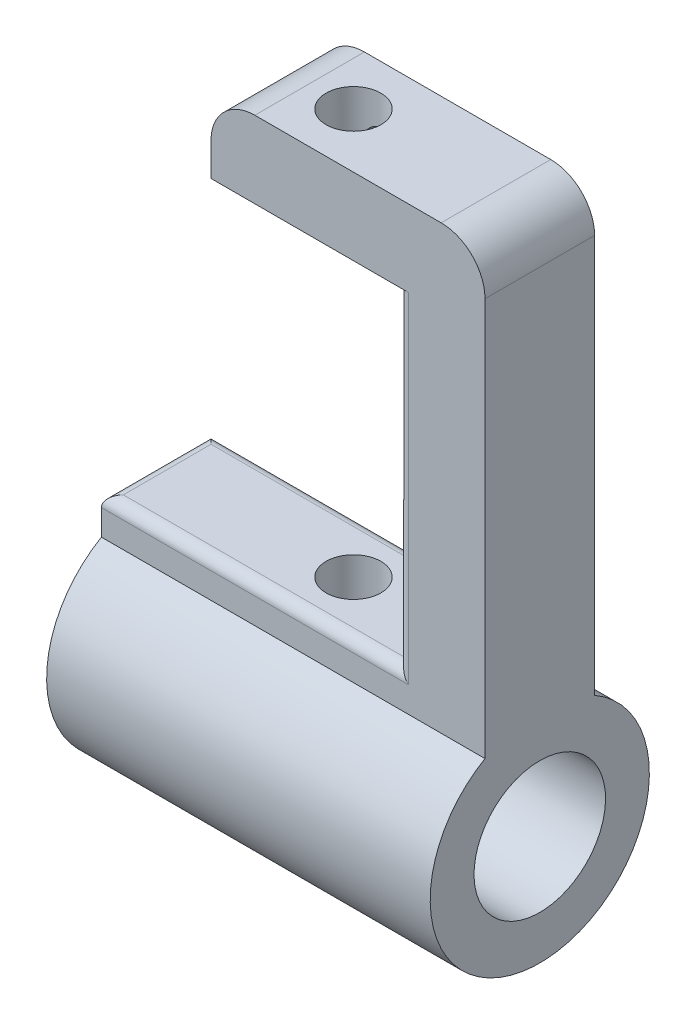
ISO-10303-21;
HEADER;
FILE_DESCRIPTION(('STEP AP214'),'2;1');
FILE_NAME('part.step','',(''),(''),'','','');
FILE_SCHEMA(('AUTOMOTIVE_DESIGN { 1 0 10303 214 1 1 1 1 }'));
ENDSEC;
DATA;
#1=APPLICATION_CONTEXT('core data for automotive mechanical design processes');
#2=APPLICATION_PROTOCOL_DEFINITION('international standard','automotive_design',2000,#1);
#3=PRODUCT_CONTEXT('',#1,'mechanical');
#4=PRODUCT('Part','Part','',(#3));
#5=PRODUCT_RELATED_PRODUCT_CATEGORY('part','',(#4));
#6=PRODUCT_DEFINITION_FORMATION('','',#4);
#7=PRODUCT_DEFINITION_CONTEXT('part definition',#1,'design');
#8=PRODUCT_DEFINITION('design','',#6,#7);
#9=PRODUCT_DEFINITION_SHAPE('','',#8);
#10=(LENGTH_UNIT() NAMED_UNIT(*) SI_UNIT(.MILLI.,.METRE.));
#11=(NAMED_UNIT(*) PLANE_ANGLE_UNIT() SI_UNIT($,.RADIAN.));
#12=(NAMED_UNIT(*) SI_UNIT($,.STERADIAN.) SOLID_ANGLE_UNIT());
#13=UNCERTAINTY_MEASURE_WITH_UNIT(LENGTH_MEASURE(1.E-05),#10,'distance_accuracy_value','');
#14=(GEOMETRIC_REPRESENTATION_CONTEXT(3) GLOBAL_UNCERTAINTY_ASSIGNED_CONTEXT((#13)) GLOBAL_UNIT_ASSIGNED_CONTEXT((#10,
#11,#12)) REPRESENTATION_CONTEXT('',''));
#15=CARTESIAN_POINT('',(0.,0.,0.));
#16=DIRECTION('',(0.,0.,1.));
#17=DIRECTION('',(1.,0.,0.));
#18=AXIS2_PLACEMENT_3D('',#15,#16,#17);
#19=CARTESIAN_POINT('',(-4.,41.,-10.));
#20=DIRECTION('',(0.,0.,1.));
#21=DIRECTION('',(-1.,0.,0.));
#22=AXIS2_PLACEMENT_3D('',#19,#20,#21);
#23=CYLINDRICAL_SURFACE('',#22,4.);
#24=CARTESIAN_POINT('',(-4.,41.,0.));
#25=DIRECTION('',(0.,0.,1.));
#26=DIRECTION('',(-1.,0.,0.));
#27=AXIS2_PLACEMENT_3D('',#24,#25,#26);
#28=CIRCLE('',#27,4.);
#29=CARTESIAN_POINT('',(0.,41.,0.));
#30=VERTEX_POINT('',#29);
#31=CARTESIAN_POINT('',(-4.,45.,0.));
#32=VERTEX_POINT('',#31);
#33=EDGE_CURVE('E335',#30,#32,#28,.T.);
#34=ORIENTED_EDGE('',*,*,#33,.F.);
#35=DIRECTION('',(0.,0.,1.));
#36=VECTOR('',#35,1.);
#37=CARTESIAN_POINT('',(0.,41.,-10.));
#38=LINE('',#37,#36);
#39=CARTESIAN_POINT('',(0.,41.,-10.));
#40=VERTEX_POINT('',#39);
#41=EDGE_CURVE('E296',#40,#30,#38,.T.);
#42=ORIENTED_EDGE('',*,*,#41,.F.);
#43=CARTESIAN_POINT('',(-4.,41.,-10.));
#44=DIRECTION('',(0.,0.,1.));
#45=DIRECTION('',(-1.,0.,0.));
#46=AXIS2_PLACEMENT_3D('',#43,#44,#45);
#47=CIRCLE('',#46,4.);
#48=CARTESIAN_POINT('',(-4.,45.,-10.));
#49=VERTEX_POINT('',#48);
#50=EDGE_CURVE('E354',#40,#49,#47,.T.);
#51=ORIENTED_EDGE('',*,*,#50,.T.);
#52=DIRECTION('',(0.,0.,1.));
#53=VECTOR('',#52,1.);
#54=CARTESIAN_POINT('',(-4.,45.,-10.));
#55=LINE('',#54,#53);
#56=EDGE_CURVE('E313',#49,#32,#55,.T.);
#57=ORIENTED_EDGE('',*,*,#56,.T.);
#58=EDGE_LOOP('',(#34,#42,#51,#57));
#59=FACE_BOUND('',#58,.T.);
#60=ADVANCED_FACE('F45',(#59),#23,.T.);
#61=CARTESIAN_POINT('',(-21.,45.,-10.));
#62=DIRECTION('',(0.,-1.,0.));
#63=DIRECTION('',(0.,0.,1.));
#64=AXIS2_PLACEMENT_3D('',#61,#62,#63);
#65=PLANE('',#64);
#66=CARTESIAN_POINT('',(-17.,45.,-5.00000000000001));
#67=DIRECTION('',(0.,-1.,0.));
#68=DIRECTION('',(0.,0.,-1.));
#69=AXIS2_PLACEMENT_3D('',#66,#67,#68);
#70=CIRCLE('',#69,2.5);
#71=CARTESIAN_POINT('',(-17.,45.,-7.50000000000001));
#72=VERTEX_POINT('',#71);
#73=EDGE_CURVE('E254',#72,#72,#70,.T.);
#74=ORIENTED_EDGE('',*,*,#73,.T.);
#75=EDGE_LOOP('',(#74));
#76=FACE_BOUND('',#75,.T.);
#77=DIRECTION('',(-1.,0.,0.));
#78=VECTOR('',#77,1.);
#79=CARTESIAN_POINT('',(-21.,45.,0.));
#80=LINE('',#79,#78);
#81=CARTESIAN_POINT('',(-21.,45.,0.));
#82=VERTEX_POINT('',#81);
#83=EDGE_CURVE('E338',#32,#82,#80,.T.);
#84=ORIENTED_EDGE('',*,*,#83,.F.);
#85=ORIENTED_EDGE('',*,*,#56,.F.);
#86=DIRECTION('',(-1.,0.,0.));
#87=VECTOR('',#86,1.);
#88=CARTESIAN_POINT('',(-21.,45.,-10.));
#89=LINE('',#88,#87);
#90=CARTESIAN_POINT('',(-21.,45.,-10.));
#91=VERTEX_POINT('',#90);
#92=EDGE_CURVE('E357',#49,#91,#89,.T.);
#93=ORIENTED_EDGE('',*,*,#92,.T.);
#94=DIRECTION('',(0.,0.,1.));
#95=VECTOR('',#94,1.);
#96=CARTESIAN_POINT('',(-21.,45.,-10.));
#97=LINE('',#96,#95);
#98=EDGE_CURVE('E310',#91,#82,#97,.T.);
#99=ORIENTED_EDGE('',*,*,#98,.T.);
#100=EDGE_LOOP('',(#84,#85,#93,#99));
#101=FACE_BOUND('',#100,.T.);
#102=ADVANCED_FACE('F224',(#76,#101),#65,.F.);
#103=CARTESIAN_POINT('',(-21.,41.,-10.));
#104=DIRECTION('',(0.,0.,1.));
#105=DIRECTION('',(-1.,0.,0.));
#106=AXIS2_PLACEMENT_3D('',#103,#104,#105);
#107=CYLINDRICAL_SURFACE('',#106,4.);
#108=CARTESIAN_POINT('',(-21.,41.,0.));
#109=DIRECTION('',(0.,0.,1.));
#110=DIRECTION('',(1.,0.,0.));
#111=AXIS2_PLACEMENT_3D('',#108,#109,#110);
#112=CIRCLE('',#111,4.);
#113=CARTESIAN_POINT('',(-25.,41.,0.));
#114=VERTEX_POINT('',#113);
#115=EDGE_CURVE('E342',#82,#114,#112,.T.);
#116=ORIENTED_EDGE('',*,*,#115,.F.);
#117=ORIENTED_EDGE('',*,*,#98,.F.);
#118=CARTESIAN_POINT('',(-21.,41.,-10.));
#119=DIRECTION('',(0.,0.,1.));
#120=DIRECTION('',(1.,0.,0.));
#121=AXIS2_PLACEMENT_3D('',#118,#119,#120);
#122=CIRCLE('',#121,4.);
#123=CARTESIAN_POINT('',(-25.,41.,-10.));
#124=VERTEX_POINT('',#123);
#125=EDGE_CURVE('E330',#91,#124,#122,.T.);
#126=ORIENTED_EDGE('',*,*,#125,.T.);
#127=DIRECTION('',(0.,0.,1.));
#128=VECTOR('',#127,1.);
#129=CARTESIAN_POINT('',(-25.,41.,-10.));
#130=LINE('',#129,#128);
#131=EDGE_CURVE('E307',#124,#114,#130,.T.);
#132=ORIENTED_EDGE('',*,*,#131,.T.);
#133=EDGE_LOOP('',(#116,#117,#126,#132));
#134=FACE_BOUND('',#133,.T.);
#135=ADVANCED_FACE('F220',(#134),#107,.T.);
#136=CARTESIAN_POINT('',(-25.,38.,-10.));
#137=DIRECTION('',(1.,0.,0.));
#138=DIRECTION('',(0.,0.,1.));
#139=AXIS2_PLACEMENT_3D('',#136,#137,#138);
#140=PLANE('',#139);
#141=DIRECTION('',(0.,-1.,0.));
#142=VECTOR('',#141,1.);
#143=CARTESIAN_POINT('',(-25.,38.,0.));
#144=LINE('',#143,#142);
#145=CARTESIAN_POINT('',(-25.,38.,0.));
#146=VERTEX_POINT('',#145);
#147=EDGE_CURVE('E345',#114,#146,#144,.T.);
#148=ORIENTED_EDGE('',*,*,#147,.F.);
#149=ORIENTED_EDGE('',*,*,#131,.F.);
#150=DIRECTION('',(0.,-1.,0.));
#151=VECTOR('',#150,1.);
#152=CARTESIAN_POINT('',(-25.,38.,-10.));
#153=LINE('',#152,#151);
#154=CARTESIAN_POINT('',(-25.,38.,-10.));
#155=VERTEX_POINT('',#154);
#156=EDGE_CURVE('E327',#124,#155,#153,.T.);
#157=ORIENTED_EDGE('',*,*,#156,.T.);
#158=DIRECTION('',(0.,0.,1.));
#159=VECTOR('',#158,1.);
#160=CARTESIAN_POINT('',(-25.,38.,-10.));
#161=LINE('',#160,#159);
#162=EDGE_CURVE('E298',#155,#146,#161,.T.);
#163=ORIENTED_EDGE('',*,*,#162,.T.);
#164=EDGE_LOOP('',(#148,#149,#157,#163));
#165=FACE_BOUND('',#164,.T.);
#166=ADVANCED_FACE('F216',(#165),#140,.F.);
#167=CARTESIAN_POINT('',(-8.,38.,-10.));
#168=DIRECTION('',(0.,1.,0.));
#169=DIRECTION('',(-1.,0.,0.));
#170=AXIS2_PLACEMENT_3D('',#167,#168,#169);
#171=PLANE('',#170);
#172=CARTESIAN_POINT('',(-17.,38.,-5.00000000000001));
#173=DIRECTION('',(0.,-1.,0.));
#174=DIRECTION('',(-1.,0.,0.));
#175=AXIS2_PLACEMENT_3D('',#172,#173,#174);
#176=CIRCLE('',#175,2.5);
#177=CARTESIAN_POINT('',(-19.5,38.,-5.00000000000001));
#178=VERTEX_POINT('',#177);
#179=EDGE_CURVE('E321',#178,#178,#176,.T.);
#180=ORIENTED_EDGE('',*,*,#179,.F.);
#181=EDGE_LOOP('',(#180));
#182=FACE_BOUND('',#181,.T.);
#183=DIRECTION('',(1.,0.,0.));
#184=VECTOR('',#183,1.);
#185=CARTESIAN_POINT('',(-8.,38.,0.));
#186=LINE('',#185,#184);
#187=CARTESIAN_POINT('',(-7.,38.,0.));
#188=VERTEX_POINT('',#187);
#189=EDGE_CURVE('E348',#146,#188,#186,.T.);
#190=ORIENTED_EDGE('',*,*,#189,.F.);
#191=ORIENTED_EDGE('',*,*,#162,.F.);
#192=DIRECTION('',(1.,0.,0.));
#193=VECTOR('',#192,1.);
#194=CARTESIAN_POINT('',(-8.,38.,-10.));
#195=LINE('',#194,#193);
#196=CARTESIAN_POINT('',(-7.,38.,-10.));
#197=VERTEX_POINT('',#196);
#198=EDGE_CURVE('E325',#155,#197,#195,.T.);
#199=ORIENTED_EDGE('',*,*,#198,.T.);
#200=CARTESIAN_POINT('',(-7.,38.,-9.));
#201=DIRECTION('',(0.,-1.,0.));
#202=DIRECTION('',(-1.,0.,0.));
#203=AXIS2_PLACEMENT_3D('',#200,#201,#202);
#204=CIRCLE('',#203,1.);
#205=CARTESIAN_POINT('',(-8.,38.,-9.));
#206=VERTEX_POINT('',#205);
#207=EDGE_CURVE('E11',#206,#197,#204,.T.);
#208=ORIENTED_EDGE('',*,*,#207,.F.);
#209=DIRECTION('',(0.,0.,1.));
#210=VECTOR('',#209,1.);
#211=CARTESIAN_POINT('',(-8.,38.,-10.));
#212=LINE('',#211,#210);
#213=CARTESIAN_POINT('',(-8.,38.,-0.999999999999999));
#214=VERTEX_POINT('',#213);
#215=EDGE_CURVE('E295',#206,#214,#212,.T.);
#216=ORIENTED_EDGE('',*,*,#215,.T.);
#217=CARTESIAN_POINT('',(-7.,38.,-0.999999999999999));
#218=DIRECTION('',(0.,-1.,0.));
#219=DIRECTION('',(-1.,0.,0.));
#220=AXIS2_PLACEMENT_3D('',#217,#218,#219);
#221=CIRCLE('',#220,1.);
#222=EDGE_CURVE('E59',#188,#214,#221,.T.);
#223=ORIENTED_EDGE('',*,*,#222,.F.);
#224=EDGE_LOOP('',(#190,#191,#199,#208,#216,#223));
#225=FACE_BOUND('',#224,.T.);
#226=ADVANCED_FACE('F212',(#182,#225),#171,.F.);
#227=CARTESIAN_POINT('',(-8.,7.99999999999998,-10.));
#228=DIRECTION('',(1.,0.,0.));
#229=DIRECTION('',(0.,1.,0.));
#230=AXIS2_PLACEMENT_3D('',#227,#228,#229);
#231=PLANE('',#230);
#232=ORIENTED_EDGE('',*,*,#215,.F.);
#233=DIRECTION('',(0.,-1.,0.));
#234=VECTOR('',#233,1.);
#235=CARTESIAN_POINT('',(-8.,7.99999999999998,-9.));
#236=LINE('',#235,#234);
#237=CARTESIAN_POINT('',(-8.,7.99999999999998,-9.));
#238=VERTEX_POINT('',#237);
#239=EDGE_CURVE('E293',#238,#206,#236,.F.);
#240=ORIENTED_EDGE('',*,*,#239,.F.);
#241=DIRECTION('',(0.,0.,1.));
#242=VECTOR('',#241,1.);
#243=CARTESIAN_POINT('',(-8.,7.99999999999998,-10.));
#244=LINE('',#243,#242);
#245=CARTESIAN_POINT('',(-8.,7.99999999999998,-0.999999999999999));
#246=VERTEX_POINT('',#245);
#247=EDGE_CURVE('E287',#238,#246,#244,.T.);
#248=ORIENTED_EDGE('',*,*,#247,.T.);
#249=DIRECTION('',(0.,-1.,0.));
#250=VECTOR('',#249,1.);
#251=CARTESIAN_POINT('',(-8.,7.99999999999998,-0.999999999999999));
#252=LINE('',#251,#250);
#253=EDGE_CURVE('E289',#214,#246,#252,.T.);
#254=ORIENTED_EDGE('',*,*,#253,.F.);
#255=EDGE_LOOP('',(#232,#240,#248,#254));
#256=FACE_BOUND('',#255,.T.);
#257=ADVANCED_FACE('F208',(#256),#231,.F.);
#258=CARTESIAN_POINT('',(-35.,7.99999999999998,-10.));
#259=DIRECTION('',(0.,-1.,0.));
#260=DIRECTION('',(0.,0.,1.));
#261=AXIS2_PLACEMENT_3D('',#258,#259,#260);
#262=PLANE('',#261);
#263=ORIENTED_EDGE('',*,*,#247,.F.);
#264=DIRECTION('',(-1.,0.,0.));
#265=VECTOR('',#264,1.);
#266=CARTESIAN_POINT('',(-35.,7.99999999999998,-9.));
#267=LINE('',#266,#265);
#268=CARTESIAN_POINT('',(-34.,7.99999999999998,-9.));
#269=VERTEX_POINT('',#268);
#270=EDGE_CURVE('E252',#269,#238,#267,.F.);
#271=ORIENTED_EDGE('',*,*,#270,.F.);
#272=DIRECTION('',(0.,0.,1.));
#273=VECTOR('',#272,1.);
#274=CARTESIAN_POINT('',(-34.,7.99999999999998,-10.));
#275=LINE('',#274,#273);
#276=CARTESIAN_POINT('',(-34.,7.99999999999998,-0.999999999999999));
#277=VERTEX_POINT('',#276);
#278=EDGE_CURVE('E259',#277,#269,#275,.F.);
#279=ORIENTED_EDGE('',*,*,#278,.F.);
#280=DIRECTION('',(-1.,0.,0.));
#281=VECTOR('',#280,1.);
#282=CARTESIAN_POINT('',(-35.,7.99999999999998,-0.999999999999999));
#283=LINE('',#282,#281);
#284=EDGE_CURVE('E272',#246,#277,#283,.T.);
#285=ORIENTED_EDGE('',*,*,#284,.F.);
#286=EDGE_LOOP('',(#263,#271,#279,#285));
#287=FACE_BOUND('',#286,.T.);
#288=CARTESIAN_POINT('',(-17.,7.99999999999998,-5.00000000000001));
#289=DIRECTION('',(0.,1.,0.));
#290=DIRECTION('',(0.,0.,1.));
#291=AXIS2_PLACEMENT_3D('',#288,#289,#290);
#292=CIRCLE('',#291,2.5);
#293=CARTESIAN_POINT('',(-17.,7.99999999999998,-2.50000000000001));
#294=VERTEX_POINT('',#293);
#295=EDGE_CURVE('E318',#294,#294,#292,.T.);
#296=ORIENTED_EDGE('',*,*,#295,.F.);
#297=EDGE_LOOP('',(#296));
#298=FACE_BOUND('',#297,.T.);
#299=ADVANCED_FACE('F204',(#287,#298),#262,.F.);
#300=CARTESIAN_POINT('',(-35.,0.,-10.));
#301=DIRECTION('',(1.,0.,0.));
#302=DIRECTION('',(0.,0.,1.));
#303=AXIS2_PLACEMENT_3D('',#300,#301,#302);
#304=PLANE('',#303);
#305=CARTESIAN_POINT('',(-35.,-4.00000000000001,-5.));
#306=DIRECTION('',(-1.,0.,0.));
#307=DIRECTION('',(0.,1.,0.));
#308=AXIS2_PLACEMENT_3D('',#305,#306,#307);
#309=CIRCLE('',#308,6.);
#310=CARTESIAN_POINT('',(-35.,1.99999999999999,-5.));
#311=VERTEX_POINT('',#310);
#312=EDGE_CURVE('E382',#311,#311,#309,.T.);
#313=ORIENTED_EDGE('',*,*,#312,.F.);
#314=EDGE_LOOP('',(#313));
#315=FACE_BOUND('',#314,.T.);
#316=DIRECTION('',(0.,-1.,0.));
#317=VECTOR('',#316,1.);
#318=CARTESIAN_POINT('',(-35.,0.,-10.));
#319=LINE('',#318,#317);
#320=CARTESIAN_POINT('',(-35.,6.99999999999998,-10.));
#321=VERTEX_POINT('',#320);
#322=CARTESIAN_POINT('',(-35.,4.66025403784439,-10.));
#323=VERTEX_POINT('',#322);
#324=EDGE_CURVE('E263',#321,#323,#319,.T.);
#325=ORIENTED_EDGE('',*,*,#324,.T.);
#326=CARTESIAN_POINT('',(-35.,-4.,-5.));
#327=DIRECTION('',(-1.,0.,0.));
#328=DIRECTION('',(0.,1.,0.));
#329=AXIS2_PLACEMENT_3D('',#326,#327,#328);
#330=CIRCLE('',#329,10.);
#331=CARTESIAN_POINT('',(-35.,4.66025403784439,0.));
#332=VERTEX_POINT('',#331);
#333=EDGE_CURVE('E377',#323,#332,#330,.T.);
#334=ORIENTED_EDGE('',*,*,#333,.T.);
#335=DIRECTION('',(0.,-1.,0.));
#336=VECTOR('',#335,1.);
#337=CARTESIAN_POINT('',(-35.,0.,0.));
#338=LINE('',#337,#336);
#339=CARTESIAN_POINT('',(-35.,6.99999999999998,0.));
#340=VERTEX_POINT('',#339);
#341=EDGE_CURVE('E351',#340,#332,#338,.T.);
#342=ORIENTED_EDGE('',*,*,#341,.F.);
#343=DIRECTION('',(0.,0.,1.));
#344=VECTOR('',#343,1.);
#345=CARTESIAN_POINT('',(-35.,6.99999999999998,-10.));
#346=LINE('',#345,#344);
#347=EDGE_CURVE('E274',#321,#340,#346,.T.);
#348=ORIENTED_EDGE('',*,*,#347,.F.);
#349=EDGE_LOOP('',(#325,#334,#342,#348));
#350=FACE_BOUND('',#349,.T.);
#351=ADVANCED_FACE('F200',(#315,#350),#304,.F.);
#352=CARTESIAN_POINT('',(0.,41.,-10.));
#353=DIRECTION('',(-1.,0.,0.));
#354=DIRECTION('',(0.,-1.,0.));
#355=AXIS2_PLACEMENT_3D('',#352,#353,#354);
#356=PLANE('',#355);
#357=CARTESIAN_POINT('',(0.,-4.,-5.));
#358=DIRECTION('',(-1.,0.,0.));
#359=DIRECTION('',(0.,1.,0.));
#360=AXIS2_PLACEMENT_3D('',#357,#358,#359);
#361=CIRCLE('',#360,6.);
#362=CARTESIAN_POINT('',(0.,2.,-5.));
#363=VERTEX_POINT('',#362);
#364=EDGE_CURVE('E384',#363,#363,#361,.T.);
#365=ORIENTED_EDGE('',*,*,#364,.T.);
#366=EDGE_LOOP('',(#365));
#367=FACE_BOUND('',#366,.T.);
#368=DIRECTION('',(0.,1.,0.));
#369=VECTOR('',#368,1.);
#370=CARTESIAN_POINT('',(0.,41.,-10.));
#371=LINE('',#370,#369);
#372=CARTESIAN_POINT('',(0.,4.6602540378444,-10.));
#373=VERTEX_POINT('',#372);
#374=EDGE_CURVE('E301',#373,#40,#371,.T.);
#375=ORIENTED_EDGE('',*,*,#374,.T.);
#376=ORIENTED_EDGE('',*,*,#41,.T.);
#377=DIRECTION('',(0.,1.,0.));
#378=VECTOR('',#377,1.);
#379=CARTESIAN_POINT('',(0.,41.,0.));
#380=LINE('',#379,#378);
#381=CARTESIAN_POINT('',(0.,4.66025403784441,0.));
#382=VERTEX_POINT('',#381);
#383=EDGE_CURVE('E353',#382,#30,#380,.T.);
#384=ORIENTED_EDGE('',*,*,#383,.F.);
#385=CARTESIAN_POINT('',(0.,-4.,-5.));
#386=DIRECTION('',(-1.,0.,0.));
#387=DIRECTION('',(0.,1.,0.));
#388=AXIS2_PLACEMENT_3D('',#385,#386,#387);
#389=CIRCLE('',#388,10.);
#390=EDGE_CURVE('E375',#373,#382,#389,.T.);
#391=ORIENTED_EDGE('',*,*,#390,.F.);
#392=EDGE_LOOP('',(#375,#376,#384,#391));
#393=FACE_BOUND('',#392,.T.);
#394=ADVANCED_FACE('F193',(#367,#393),#356,.F.);
#395=CARTESIAN_POINT('',(-4.,41.,-10.));
#396=DIRECTION('',(0.,0.,1.));
#397=DIRECTION('',(-1.,0.,0.));
#398=AXIS2_PLACEMENT_3D('',#395,#396,#397);
#399=PLANE('',#398);
#400=CARTESIAN_POINT('',(-17.,41.,-10.));
#401=DIRECTION('',(0.,0.,1.));
#402=DIRECTION('',(1.,0.,0.));
#403=AXIS2_PLACEMENT_3D('',#400,#401,#402);
#404=CIRCLE('',#403,1.525);
#405=CARTESIAN_POINT('',(-15.475,41.,-10.));
#406=VERTEX_POINT('',#405);
#407=EDGE_CURVE('E163',#406,#406,#404,.T.);
#408=ORIENTED_EDGE('',*,*,#407,.T.);
#409=EDGE_LOOP('',(#408));
#410=FACE_BOUND('',#409,.T.);
#411=ORIENTED_EDGE('',*,*,#198,.F.);
#412=ORIENTED_EDGE('',*,*,#156,.F.);
#413=ORIENTED_EDGE('',*,*,#125,.F.);
#414=ORIENTED_EDGE('',*,*,#92,.F.);
#415=ORIENTED_EDGE('',*,*,#50,.F.);
#416=ORIENTED_EDGE('',*,*,#374,.F.);
#417=DIRECTION('',(1.,0.,0.));
#418=VECTOR('',#417,1.);
#419=CARTESIAN_POINT('',(-35.,4.66025403784439,-10.));
#420=LINE('',#419,#418);
#421=EDGE_CURVE('E339',#323,#373,#420,.T.);
#422=ORIENTED_EDGE('',*,*,#421,.F.);
#423=ORIENTED_EDGE('',*,*,#324,.F.);
#424=DIRECTION('',(-1.,0.,0.));
#425=VECTOR('',#424,1.);
#426=CARTESIAN_POINT('',(-4.,6.99999999999999,-10.));
#427=LINE('',#426,#425);
#428=CARTESIAN_POINT('',(-7.,6.99999999999999,-10.));
#429=VERTEX_POINT('',#428);
#430=EDGE_CURVE('E249',#429,#321,#427,.T.);
#431=ORIENTED_EDGE('',*,*,#430,.F.);
#432=DIRECTION('',(0.,-1.,0.));
#433=VECTOR('',#432,1.);
#434=CARTESIAN_POINT('',(-7.,41.,-10.));
#435=LINE('',#434,#433);
#436=EDGE_CURVE('E255',#197,#429,#435,.T.);
#437=ORIENTED_EDGE('',*,*,#436,.F.);
#438=EDGE_LOOP('',(#411,#412,#413,#414,#415,#416,#422,#423,#431,#437));
#439=FACE_BOUND('',#438,.T.);
#440=ADVANCED_FACE('F190',(#410,#439),#399,.F.);
#441=CARTESIAN_POINT('',(-4.,41.,0.));
#442=DIRECTION('',(0.,0.,1.));
#443=DIRECTION('',(-1.,0.,0.));
#444=AXIS2_PLACEMENT_3D('',#441,#442,#443);
#445=PLANE('',#444);
#446=DIRECTION('',(0.,-1.,0.));
#447=VECTOR('',#446,1.);
#448=CARTESIAN_POINT('',(-7.,38.,0.));
#449=LINE('',#448,#447);
#450=CARTESIAN_POINT('',(-7.,6.99999999999998,0.));
#451=VERTEX_POINT('',#450);
#452=EDGE_CURVE('E264',#451,#188,#449,.F.);
#453=ORIENTED_EDGE('',*,*,#452,.F.);
#454=DIRECTION('',(-1.,0.,0.));
#455=VECTOR('',#454,1.);
#456=CARTESIAN_POINT('',(-8.,6.99999999999998,0.));
#457=LINE('',#456,#455);
#458=EDGE_CURVE('E266',#340,#451,#457,.F.);
#459=ORIENTED_EDGE('',*,*,#458,.F.);
#460=ORIENTED_EDGE('',*,*,#341,.T.);
#461=DIRECTION('',(1.,0.,0.));
#462=VECTOR('',#461,1.);
#463=CARTESIAN_POINT('',(-35.,4.66025403784439,0.));
#464=LINE('',#463,#462);
#465=EDGE_CURVE('E316',#332,#382,#464,.T.);
#466=ORIENTED_EDGE('',*,*,#465,.T.);
#467=ORIENTED_EDGE('',*,*,#383,.T.);
#468=ORIENTED_EDGE('',*,*,#33,.T.);
#469=ORIENTED_EDGE('',*,*,#83,.T.);
#470=ORIENTED_EDGE('',*,*,#115,.T.);
#471=ORIENTED_EDGE('',*,*,#147,.T.);
#472=ORIENTED_EDGE('',*,*,#189,.T.);
#473=EDGE_LOOP('',(#453,#459,#460,#466,#467,#468,#469,#470,#471,#472));
#474=FACE_BOUND('',#473,.T.);
#475=ADVANCED_FACE('F188',(#474),#445,.T.);
#476=CARTESIAN_POINT('',(-35.,-4.,-5.));
#477=DIRECTION('',(1.,0.,0.));
#478=DIRECTION('',(0.,1.,0.));
#479=AXIS2_PLACEMENT_3D('',#476,#477,#478);
#480=CYLINDRICAL_SURFACE('',#479,10.);
#481=ORIENTED_EDGE('',*,*,#421,.T.);
#482=ORIENTED_EDGE('',*,*,#390,.T.);
#483=ORIENTED_EDGE('',*,*,#465,.F.);
#484=ORIENTED_EDGE('',*,*,#333,.F.);
#485=EDGE_LOOP('',(#481,#482,#483,#484));
#486=FACE_BOUND('',#485,.T.);
#487=ADVANCED_FACE('F184',(#486),#480,.T.);
#488=CARTESIAN_POINT('',(-35.,-4.00000000000001,-5.));
#489=DIRECTION('',(1.,0.,0.));
#490=DIRECTION('',(0.,1.,0.));
#491=AXIS2_PLACEMENT_3D('',#488,#489,#490);
#492=CYLINDRICAL_SURFACE('',#491,6.);
#493=ORIENTED_EDGE('',*,*,#312,.T.);
#494=EDGE_LOOP('',(#493));
#495=FACE_BOUND('',#494,.T.);
#496=ORIENTED_EDGE('',*,*,#364,.F.);
#497=EDGE_LOOP('',(#496));
#498=FACE_BOUND('',#497,.T.);
#499=ADVANCED_FACE('F180',(#495,#498),#492,.F.);
#500=CARTESIAN_POINT('',(-17.,3.99999999999996,-5.00000000000001));
#501=DIRECTION('',(0.,1.,0.));
#502=DIRECTION('',(0.,0.,-1.));
#503=AXIS2_PLACEMENT_3D('',#500,#501,#502);
#504=PLANE('',#503);
#505=CARTESIAN_POINT('',(-17.,3.99999999999996,-5.00000000000001));
#506=DIRECTION('',(0.,-1.,0.));
#507=DIRECTION('',(0.,0.,-1.));
#508=AXIS2_PLACEMENT_3D('',#505,#506,#507);
#509=CIRCLE('',#508,2.5);
#510=CARTESIAN_POINT('',(-17.,3.99999999999996,-7.50000000000001));
#511=VERTEX_POINT('',#510);
#512=EDGE_CURVE('E322',#511,#511,#509,.T.);
#513=ORIENTED_EDGE('',*,*,#512,.F.);
#514=EDGE_LOOP('',(#513));
#515=FACE_BOUND('',#514,.T.);
#516=ADVANCED_FACE('F179',(#515),#504,.T.);
#517=CARTESIAN_POINT('',(-17.,3.99999999999996,-5.00000000000001));
#518=DIRECTION('',(0.,1.,0.));
#519=DIRECTION('',(0.,0.,-1.));
#520=AXIS2_PLACEMENT_3D('',#517,#518,#519);
#521=CYLINDRICAL_SURFACE('',#520,2.5);
#522=ORIENTED_EDGE('',*,*,#512,.T.);
#523=EDGE_LOOP('',(#522));
#524=FACE_BOUND('',#523,.T.);
#525=ORIENTED_EDGE('',*,*,#295,.T.);
#526=EDGE_LOOP('',(#525));
#527=FACE_BOUND('',#526,.T.);
#528=ADVANCED_FACE('F177',(#524,#527),#521,.F.);
#529=CARTESIAN_POINT('',(-17.,39.75,-7.50000000000001));
#530=CARTESIAN_POINT('',(-16.9342850463088,39.7500041278994,-7.49999641755189));
#531=CARTESIAN_POINT('',(-16.8684917503775,39.7552125914021,-7.49738113774398));
#532=CARTESIAN_POINT('',(-16.7388497059145,39.7758161004261,-7.48717695046746));
#533=CARTESIAN_POINT('',(-16.6750048916081,39.791230491247,-7.4795785978623));
#534=CARTESIAN_POINT('',(-16.5513330688993,39.831492260771,-7.4602034925414));
#535=CARTESIAN_POINT('',(-16.491491496326,39.85630298031,-7.44844298971901));
#536=CARTESIAN_POINT('',(-16.3769092289918,39.9144632767062,-7.42182220644724));
#537=CARTESIAN_POINT('',(-16.3221681325124,39.9478121803111,-7.40696217041913));
#538=CARTESIAN_POINT('',(-16.2156152277976,40.0243965618566,-7.37445322822572));
#539=CARTESIAN_POINT('',(-16.1641809860974,40.0681080990495,-7.35668998909421));
#540=CARTESIAN_POINT('',(-16.0690256939163,40.1631518490588,-7.32074962808431));
#541=CARTESIAN_POINT('',(-16.0253105211166,40.2144898147155,-7.30257220261295));
#542=CARTESIAN_POINT('',(-15.9434349994372,40.3281041869042,-7.26623688996685));
#543=CARTESIAN_POINT('',(-15.9059683305605,40.3909201229324,-7.24818983712666));
#544=CARTESIAN_POINT('',(-15.8422897163866,40.5229591699828,-7.21607473465402));
#545=CARTESIAN_POINT('',(-15.8160697312921,40.5921776609034,-7.20200384508738));
#546=CARTESIAN_POINT('',(-15.7773344472643,40.7308313817774,-7.18072333797262));
#547=CARTESIAN_POINT('',(-15.7640926786495,40.8000055650842,-7.17315339479643));
#548=CARTESIAN_POINT('',(-15.749466258364,40.9399735472243,-7.16477362435661));
#549=CARTESIAN_POINT('',(-15.7480698895337,41.0107656760889,-7.16395711679112));
#550=CARTESIAN_POINT('',(-15.7566408910346,41.1428575303942,-7.16888662821562));
#551=CARTESIAN_POINT('',(-15.765269300579,41.2042800390288,-7.17385954577519));
#552=CARTESIAN_POINT('',(-15.7913251886789,41.3246523867163,-7.18845285917315));
#553=CARTESIAN_POINT('',(-15.808755470128,41.3836014316316,-7.19807473539722));
#554=CARTESIAN_POINT('',(-15.8522377745175,41.499036415707,-7.22109345515928));
#555=CARTESIAN_POINT('',(-15.878481166105,41.5554329984822,-7.2345730083));
#556=CARTESIAN_POINT('',(-15.938697890415,41.6632928657375,-7.26379255351756));
#557=CARTESIAN_POINT('',(-15.9726746952344,41.7147539195001,-7.2795335597524));
#558=CARTESIAN_POINT('',(-16.052417431359,41.818151565929,-7.31391447379109));
#559=CARTESIAN_POINT('',(-16.0991319270384,41.8693210919702,-7.33266887795934));
#560=CARTESIAN_POINT('',(-16.2005555265733,41.9634192732386,-7.36934529125511));
#561=CARTESIAN_POINT('',(-16.2552684292822,42.0063439900423,-7.38726689948502));
#562=CARTESIAN_POINT('',(-16.3743543677102,42.0846070762871,-7.42127484103706));
#563=CARTESIAN_POINT('',(-16.4390580105008,42.1195005905571,-7.4372373020251));
#564=CARTESIAN_POINT('',(-16.574417230639,42.1776212863037,-7.46447351401554));
#565=CARTESIAN_POINT('',(-16.6450680296684,42.2008577312689,-7.47575098679442));
#566=CARTESIAN_POINT('',(-16.7840418854241,42.2330942546458,-7.49155417176796));
#567=CARTESIAN_POINT('',(-16.8520730868146,42.2431140446834,-7.4965617287664));
#568=CARTESIAN_POINT('',(-16.9890255000633,42.2518309139181,-7.50091266823878));
#569=CARTESIAN_POINT('',(-17.0579462748374,42.2505333570493,-7.50025873401641));
#570=CARTESIAN_POINT('',(-17.1890412149825,42.2372416394765,-7.49363990316801));
#571=CARTESIAN_POINT('',(-17.2513242600625,42.2260843340874,-7.48809057110238));
#572=CARTESIAN_POINT('',(-17.3730086153774,42.1947024101311,-7.47277714143524));
#573=CARTESIAN_POINT('',(-17.4324096071138,42.1744767919333,-7.46301257917916));
#574=CARTESIAN_POINT('',(-17.5486107605621,42.1250019169585,-7.43980314267087));
#575=CARTESIAN_POINT('',(-17.6052879962577,42.0955111873539,-7.42626102212424));
#576=CARTESIAN_POINT('',(-17.7130767021237,42.0286155804424,-7.39679967896386));
#577=CARTESIAN_POINT('',(-17.7641857872191,41.9912073317582,-7.38087944457232));
#578=CARTESIAN_POINT('',(-17.8647096116133,41.9052994683339,-7.34635276671831));
#579=CARTESIAN_POINT('',(-17.9134650972808,41.856071414433,-7.32763606060552));
#580=CARTESIAN_POINT('',(-18.0023204013916,41.7500935609133,-7.29077989504843));
#581=CARTESIAN_POINT('',(-18.0424142321136,41.6933386014795,-7.27264084226908));
#582=CARTESIAN_POINT('',(-18.1146348931221,41.5704454322496,-7.23813990282585));
#583=CARTESIAN_POINT('',(-18.1462818698483,41.5039859172392,-7.2219066207934));
#584=CARTESIAN_POINT('',(-18.1976035325173,41.3656124153843,-7.19467590460158));
#585=CARTESIAN_POINT('',(-18.2172936448595,41.2937055918735,-7.18367172800773));
#586=CARTESIAN_POINT('',(-18.2423271093121,41.1538622214231,-7.16951876260834));
#587=CARTESIAN_POINT('',(-18.2488662455011,41.0862071832137,-7.16571729325614));
#588=CARTESIAN_POINT('',(-18.250861442976,40.9506911660365,-7.16456693307719));
#589=CARTESIAN_POINT('',(-18.2463223082805,40.8828302890757,-7.16721524534441));
#590=CARTESIAN_POINT('',(-18.2274076569903,40.7556456230849,-7.17797327562532));
#591=CARTESIAN_POINT('',(-18.2140103929285,40.6961244123195,-7.18553868102993));
#592=CARTESIAN_POINT('',(-18.1789691977808,40.5802398507191,-7.20463770234898));
#593=CARTESIAN_POINT('',(-18.1573226139498,40.523877522385,-7.21617259462095));
#594=CARTESIAN_POINT('',(-18.1047696816259,40.4117189362667,-7.24285662955661));
#595=CARTESIAN_POINT('',(-18.0733389222706,40.3562151227128,-7.25819652995239));
#596=CARTESIAN_POINT('',(-18.0026887145458,40.2509068297742,-7.29044164543239));
#597=CARTESIAN_POINT('',(-17.9634652140483,40.2011053368519,-7.30734767243153));
#598=CARTESIAN_POINT('',(-17.8727541583308,40.1023225220529,-7.34327903949142));
#599=CARTESIAN_POINT('',(-17.8203555287627,40.0541761220476,-7.36231229139337));
#600=CARTESIAN_POINT('',(-17.7076935077753,39.9671712707204,-7.3984719031886));
#601=CARTESIAN_POINT('',(-17.647425904071,39.9283178257171,-7.41559723260051));
#602=CARTESIAN_POINT('',(-17.5199144960249,39.8609545465472,-7.4462251198138));
#603=CARTESIAN_POINT('',(-17.4526243799183,39.8325197882357,-7.45970120703637));
#604=CARTESIAN_POINT('',(-17.3134276266177,39.7877397901013,-7.48126676704333));
#605=CARTESIAN_POINT('',(-17.241534749529,39.771360191463,-7.48937154216166));
#606=CARTESIAN_POINT('',(-17.1407524331042,39.7576282361552,-7.4961932738708));
#607=CARTESIAN_POINT('',(-17.1127023492994,39.7547716989205,-7.49761706674003));
#608=CARTESIAN_POINT('',(-17.0564396647589,39.750956668104,-7.49952121222332));
#609=CARTESIAN_POINT('',(-17.0282270595592,39.749998226911,-7.50000153879705));
#610=CARTESIAN_POINT('',(-17.,39.75,-7.50000000000001));
#611=B_SPLINE_CURVE_WITH_KNOTS('',3,(#529,#530,#531,#532,#533,#534,#535,#536,#537,#538,#539,
#540,#541,#542,#543,#544,#545,#546,#547,#548,#549,#550,#551,#552,#553,#554,#555,#556,#557,#558,
#559,#560,#561,#562,#563,#564,#565,#566,#567,#568,#569,#570,#571,#572,#573,#574,#575,#576,#577,
#578,#579,#580,#581,#582,#583,#584,#585,#586,#587,#588,#589,#590,#591,#592,#593,#594,#595,#596,
#597,#598,#599,#600,#601,#602,#603,#604,#605,#606,#607,#608,#609,#610),.UNSPECIFIED.,.T.,.F.,(4,
2,2,2,2,2,2,2,2,2,2,2,2,2,2,2,2,2,2,2,2,2,2,2,2,2,2,2,2,2,2,2,2,2,2,2,2,2,2,2,4),(0.,
0.197030321775363,0.394435187136494,0.59107769436537,0.787704700726955,0.996227198397602,
1.20490779706753,1.42977158038439,1.6544743487285,1.86572515175286,2.07676696661274,
2.26257140511649,2.44843504907095,2.63862800210608,2.82890651575276,3.04331176667347,
3.25781918248355,3.48228777768048,3.70657771140347,3.91229113089179,4.11790705639342,
4.30758633132649,4.49728652038661,4.6924107003487,4.88761813435421,5.10199513305521,
5.31651985769286,5.54143352699589,5.76605639925968,5.96911634372963,6.17208824825003,
6.35572412805224,6.53941910979593,6.73545570969513,6.93159451423693,7.15156553440619,
7.37165479220712,7.59330017078652,7.81431135781158,7.89894100172117,7.98357298143554),.UNSPECIFIED.);
#612=CARTESIAN_POINT('',(-17.,39.75,-7.50000000000001));
#613=VERTEX_POINT('',#612);
#614=EDGE_CURVE('E49',#613,#613,#611,.T.);
#615=ORIENTED_EDGE('',*,*,#614,.F.);
#616=EDGE_LOOP('',(#615));
#617=FACE_BOUND('',#616,.T.);
#618=CARTESIAN_POINT('',(-17.5025364985941,41.0158825832395,-2.55102938613369));
#619=CARTESIAN_POINT('',(-17.501608751922,41.0351680847767,-2.55083878343187));
#620=CARTESIAN_POINT('',(-17.4989862706678,41.0543847466289,-2.55029959130958));
#621=CARTESIAN_POINT('',(-17.4905410119934,41.0920831503092,-2.54859484237114));
#622=CARTESIAN_POINT('',(-17.484713168309,41.1105636789169,-2.54742829404654));
#623=CARTESIAN_POINT('',(-17.4702799561469,41.146225820217,-2.54462018423395));
#624=CARTESIAN_POINT('',(-17.4616912347517,41.1634144747741,-2.54298147568845));
#625=CARTESIAN_POINT('',(-17.4421539788085,41.1963418648352,-2.53939065808653));
#626=CARTESIAN_POINT('',(-17.4312052168583,41.2120804604098,-2.53743851883407));
#627=CARTESIAN_POINT('',(-17.4054830351785,41.2442904228454,-2.53306290956684));
#628=CARTESIAN_POINT('',(-17.3903794962812,41.2604938841655,-2.53061339300247));
#629=CARTESIAN_POINT('',(-17.3580690661754,41.2906442106133,-2.52572149394));
#630=CARTESIAN_POINT('',(-17.3408607515513,41.304589533632,-2.52327911742634));
#631=CARTESIAN_POINT('',(-17.3011239800229,41.332723631055,-2.51810528659165));
#632=CARTESIAN_POINT('',(-17.278222442878,41.3463944774152,-2.5154148489103));
#633=CARTESIAN_POINT('',(-17.2306216109962,41.3702547671496,-2.51054476823945));
#634=CARTESIAN_POINT('',(-17.2059212909082,41.3804422057523,-2.5083654196179));
#635=CARTESIAN_POINT('',(-17.1519144930001,41.3983463258111,-2.50445457390189));
#636=CARTESIAN_POINT('',(-17.1224315732118,41.4055561691641,-2.50282079921216));
#637=CARTESIAN_POINT('',(-17.0626625055385,41.4152574354396,-2.50060635709876));
#638=CARTESIAN_POINT('',(-17.0323762272291,41.417748087393,-2.50002586174884));
#639=CARTESIAN_POINT('',(-16.9704963347851,41.4179695646398,-2.49997480656154));
#640=CARTESIAN_POINT('',(-16.9389016972154,41.4154942529306,-2.50055231491501));
#641=CARTESIAN_POINT('',(-16.8765705846522,41.4054111276442,-2.50285389312601));
#642=CARTESIAN_POINT('',(-16.8458344883059,41.3978010855597,-2.50457846081038));
#643=CARTESIAN_POINT('',(-16.7860754560279,41.377563024856,-2.50898897522365));
#644=CARTESIAN_POINT('',(-16.7570553459383,41.364926980139,-2.51167645896317));
#645=CARTESIAN_POINT('',(-16.7017189941361,41.3348005902863,-2.51770237392739));
#646=CARTESIAN_POINT('',(-16.6754010551322,41.3173133181846,-2.52104039267057));
#647=CARTESIAN_POINT('',(-16.6318651371177,41.2819881340215,-2.52717737527311));
#648=CARTESIAN_POINT('',(-16.6139111090943,41.2650475642416,-2.52993638255741));
#649=CARTESIAN_POINT('',(-16.5810001538238,41.2284488766523,-2.53530606233683));
#650=CARTESIAN_POINT('',(-16.5660390254033,41.2087946345479,-2.53791693902141));
#651=CARTESIAN_POINT('',(-16.5422759203299,41.1708141193554,-2.54223518565314));
#652=CARTESIAN_POINT('',(-16.53284965573,41.1528884754847,-2.54402057563583));
#653=CARTESIAN_POINT('',(-16.5170474439749,41.1156926867782,-2.54707888775339));
#654=CARTESIAN_POINT('',(-16.5106692563404,41.0964235414543,-2.54835218619007));
#655=CARTESIAN_POINT('',(-16.5013775737159,41.0569016237524,-2.55022469969297));
#656=CARTESIAN_POINT('',(-16.4984847149702,41.0366437246027,-2.55081989869064));
#657=CARTESIAN_POINT('',(-16.4964818242206,40.9959345511901,-2.55123076077242));
#658=CARTESIAN_POINT('',(-16.4973705922149,40.9754833403249,-2.5510466711438));
#659=CARTESIAN_POINT('',(-16.5025797966319,40.9370704465671,-2.54998394468279));
#660=CARTESIAN_POINT('',(-16.5065604641958,40.9190591072787,-2.54917411411046));
#661=CARTESIAN_POINT('',(-16.5172752873325,40.883912300802,-2.54704129028061));
#662=CARTESIAN_POINT('',(-16.5240101750583,40.8667770678722,-2.54571816057785));
#663=CARTESIAN_POINT('',(-16.5403453372086,40.8327247615375,-2.54260498030127));
#664=CARTESIAN_POINT('',(-16.5500913309489,40.8158803216436,-2.54079197135496));
#665=CARTESIAN_POINT('',(-16.5718334154296,40.7837524689098,-2.5369134571111));
#666=CARTESIAN_POINT('',(-16.5838305556345,40.7684697893022,-2.53484783420425));
#667=CARTESIAN_POINT('',(-16.6120807101591,40.7369130986364,-2.53023099451786));
#668=CARTESIAN_POINT('',(-16.6287104290856,40.7209794970484,-2.52766068403106));
#669=CARTESIAN_POINT('',(-16.6640412391975,40.6915897510953,-2.52261207112372));
#670=CARTESIAN_POINT('',(-16.6827437517126,40.6781353237621,-2.5201338334125));
#671=CARTESIAN_POINT('',(-16.7255546755563,40.6514265878746,-2.51499927999631));
#672=CARTESIAN_POINT('',(-16.750009195702,40.6387137864209,-2.51240115547139));
#673=CARTESIAN_POINT('',(-16.8005852761577,40.6170460730206,-2.50783633288151));
#674=CARTESIAN_POINT('',(-16.8267076482454,40.6080930073269,-2.50586994514785));
#675=CARTESIAN_POINT('',(-16.8830331527386,40.5932592088441,-2.50256133707821));
#676=CARTESIAN_POINT('',(-16.9133642563475,40.5878388448847,-2.5013145202443));
#677=CARTESIAN_POINT('',(-16.9745259598492,40.5818833333973,-2.49994249810834));
#678=CARTESIAN_POINT('',(-17.0053566208975,40.5813487885836,-2.4998174311853));
#679=CARTESIAN_POINT('',(-17.0676130829932,40.5852324519514,-2.50071497524421));
#680=CARTESIAN_POINT('',(-17.0990293084594,40.5897984532403,-2.50177183468147));
#681=CARTESIAN_POINT('',(-17.1606439903478,40.6040410756362,-2.50497574043832));
#682=CARTESIAN_POINT('',(-17.1908417813636,40.6137204496406,-2.50712337397624));
#683=CARTESIAN_POINT('',(-17.2489989927982,40.637995048209,-2.51226018836194));
#684=CARTESIAN_POINT('',(-17.2769657125873,40.6525733538524,-2.51524646711581));
#685=CARTESIAN_POINT('',(-17.3297945050391,40.6864841730811,-2.5217058762642));
#686=CARTESIAN_POINT('',(-17.3546598254378,40.7058116493134,-2.52517848914603));
#687=CARTESIAN_POINT('',(-17.3942841585126,40.7434666439065,-2.53122808898091));
#688=CARTESIAN_POINT('',(-17.4100022148283,40.7607882780621,-2.53380724789876));
#689=CARTESIAN_POINT('',(-17.4384298732608,40.7977852654881,-2.53870221490135));
#690=CARTESIAN_POINT('',(-17.4511432228879,40.8174576402586,-2.54101834913988));
#691=CARTESIAN_POINT('',(-17.4710582039261,40.8554492570149,-2.54476273756392));
#692=CARTESIAN_POINT('',(-17.4788206287596,40.8734657751112,-2.54627419477743));
#693=CARTESIAN_POINT('',(-17.4912727551326,40.9105553496404,-2.54873662725794));
#694=CARTESIAN_POINT('',(-17.4959685415125,40.9296262318955,-2.54968871205542));
#695=CARTESIAN_POINT('',(-17.5006862857556,40.9600116481789,-2.55064991424485));
#696=CARTESIAN_POINT('',(-17.5018484903775,40.9711518803478,-2.55088822302196));
#697=CARTESIAN_POINT('',(-17.5030425999374,40.99349664525,-2.55113322480415));
#698=CARTESIAN_POINT('',(-17.5030743900013,41.0047011844025,-2.55113989426977));
#699=CARTESIAN_POINT('',(-17.5025364985941,41.0158825832395,-2.55102938613369));
#700=B_SPLINE_CURVE_WITH_KNOTS('',3,(#618,#619,#620,#621,#622,#623,#624,#625,#626,#627,#628,
#629,#630,#631,#632,#633,#634,#635,#636,#637,#638,#639,#640,#641,#642,#643,#644,#645,#646,#647,
#648,#649,#650,#651,#652,#653,#654,#655,#656,#657,#658,#659,#660,#661,#662,#663,#664,#665,#666,
#667,#668,#669,#670,#671,#672,#673,#674,#675,#676,#677,#678,#679,#680,#681,#682,#683,#684,#685,
#686,#687,#688,#689,#690,#691,#692,#693,#694,#695,#696,#697,#698,#699),.UNSPECIFIED.,.T.,.F.,(4,
2,2,2,2,2,2,2,2,2,2,2,2,2,2,2,2,2,2,2,2,2,2,2,2,2,2,2,2,2,2,2,2,2,2,2,2,2,2,2,4),(0.,
0.0578820660927812,0.115855882207751,0.173486495556285,0.231122664395347,0.297739077573281,
0.364400793747717,0.444504414040098,0.524654058292498,0.615432977371782,0.70622672562504,
0.800867256800705,0.895548889046565,0.990382330765241,1.08515583640668,1.1593898233604,
1.23351886436388,1.29426777409285,1.35497196158763,1.41603383277078,1.47707632898709,
1.53222252499842,1.58738339003435,1.64580156085317,1.70424703366743,1.77351438999636,
1.84282954081593,1.92554460556923,2.0083002409563,2.10038896169146,2.19248904232873,
2.28732864952659,2.38221936783892,2.47678568373537,2.57125212470465,2.64158589207033,
2.71183146976369,2.77061856500195,2.82928865728116,2.86284426394483,2.89640328055865),.UNSPECIFIED.);
#701=CARTESIAN_POINT('',(-17.5025364985941,41.0158825832395,-2.55102938613369));
#702=VERTEX_POINT('',#701);
#703=EDGE_CURVE('E157',#702,#702,#700,.T.);
#704=ORIENTED_EDGE('',*,*,#703,.F.);
#705=EDGE_LOOP('',(#704));
#706=FACE_BOUND('',#705,.T.);
#707=ORIENTED_EDGE('',*,*,#73,.F.);
#708=EDGE_LOOP('',(#707));
#709=FACE_BOUND('',#708,.T.);
#710=ORIENTED_EDGE('',*,*,#179,.T.);
#711=EDGE_LOOP('',(#710));
#712=FACE_BOUND('',#711,.T.);
#713=ADVANCED_FACE('F173',(#617,#706,#709,#712),#521,.F.);
#714=CARTESIAN_POINT('',(-7.,41.,-9.));
#715=DIRECTION('',(0.,-1.,0.));
#716=DIRECTION('',(1.,0.,0.));
#717=AXIS2_PLACEMENT_3D('',#714,#715,#716);
#718=CYLINDRICAL_SURFACE('',#717,1.);
#719=ORIENTED_EDGE('',*,*,#207,.T.);
#720=ORIENTED_EDGE('',*,*,#436,.T.);
#721=CARTESIAN_POINT('',(-7.,6.99999999999999,-9.));
#722=DIRECTION('',(0.707106781186548,0.707106781186547,0.));
#723=DIRECTION('',(0.707106781186547,-0.707106781186548,0.));
#724=AXIS2_PLACEMENT_3D('',#721,#722,#723);
#725=ELLIPSE('',#724,1.41421356237309,1.);
#726=EDGE_CURVE('E169',#429,#238,#725,.T.);
#727=ORIENTED_EDGE('',*,*,#726,.T.);
#728=ORIENTED_EDGE('',*,*,#239,.T.);
#729=EDGE_LOOP('',(#719,#720,#727,#728));
#730=FACE_BOUND('',#729,.T.);
#731=ADVANCED_FACE('F47',(#730),#718,.T.);
#732=CARTESIAN_POINT('',(-4.,6.99999999999999,-9.));
#733=DIRECTION('',(-1.,0.,0.));
#734=DIRECTION('',(0.,0.,-1.));
#735=AXIS2_PLACEMENT_3D('',#732,#733,#734);
#736=CYLINDRICAL_SURFACE('',#735,1.);
#737=ORIENTED_EDGE('',*,*,#726,.F.);
#738=ORIENTED_EDGE('',*,*,#430,.T.);
#739=CARTESIAN_POINT('',(-34.,6.99999999999998,-9.));
#740=DIRECTION('',(0.707106781186547,0.,-0.707106781186547));
#741=DIRECTION('',(0.707106781186547,0.,0.707106781186547));
#742=AXIS2_PLACEMENT_3D('',#739,#740,#741);
#743=ELLIPSE('',#742,1.41421356237309,1.);
#744=EDGE_CURVE('E67',#321,#269,#743,.T.);
#745=ORIENTED_EDGE('',*,*,#744,.T.);
#746=ORIENTED_EDGE('',*,*,#270,.T.);
#747=EDGE_LOOP('',(#737,#738,#745,#746));
#748=FACE_BOUND('',#747,.T.);
#749=ADVANCED_FACE('F241',(#748),#736,.T.);
#750=CARTESIAN_POINT('',(-34.,6.99999999999998,-10.));
#751=DIRECTION('',(0.,0.,1.));
#752=DIRECTION('',(-1.,0.,0.));
#753=AXIS2_PLACEMENT_3D('',#750,#751,#752);
#754=CYLINDRICAL_SURFACE('',#753,1.);
#755=ORIENTED_EDGE('',*,*,#744,.F.);
#756=ORIENTED_EDGE('',*,*,#347,.T.);
#757=CARTESIAN_POINT('',(-34.,6.99999999999998,-0.999999999999999));
#758=DIRECTION('',(-0.707106781186547,0.,-0.707106781186547));
#759=DIRECTION('',(-0.707106781186547,0.,0.707106781186547));
#760=AXIS2_PLACEMENT_3D('',#757,#758,#759);
#761=ELLIPSE('',#760,1.41421356237309,1.);
#762=EDGE_CURVE('E74',#340,#277,#761,.T.);
#763=ORIENTED_EDGE('',*,*,#762,.T.);
#764=ORIENTED_EDGE('',*,*,#278,.T.);
#765=EDGE_LOOP('',(#755,#756,#763,#764));
#766=FACE_BOUND('',#765,.T.);
#767=ADVANCED_FACE('F238',(#766),#754,.T.);
#768=CARTESIAN_POINT('',(-35.,6.99999999999998,-0.999999999999999));
#769=DIRECTION('',(1.,0.,0.));
#770=DIRECTION('',(0.,0.,1.));
#771=AXIS2_PLACEMENT_3D('',#768,#769,#770);
#772=CYLINDRICAL_SURFACE('',#771,1.);
#773=ORIENTED_EDGE('',*,*,#762,.F.);
#774=ORIENTED_EDGE('',*,*,#458,.T.);
#775=CARTESIAN_POINT('',(-7.,6.99999999999998,-0.999999999999999));
#776=DIRECTION('',(-0.707106781186548,-0.707106781186547,0.));
#777=DIRECTION('',(-0.707106781186547,0.707106781186548,0.));
#778=AXIS2_PLACEMENT_3D('',#775,#776,#777);
#779=ELLIPSE('',#778,1.41421356237309,1.);
#780=EDGE_CURVE('E161',#451,#246,#779,.T.);
#781=ORIENTED_EDGE('',*,*,#780,.T.);
#782=ORIENTED_EDGE('',*,*,#284,.T.);
#783=EDGE_LOOP('',(#773,#774,#781,#782));
#784=FACE_BOUND('',#783,.T.);
#785=ADVANCED_FACE('F234',(#784),#772,.T.);
#786=CARTESIAN_POINT('',(-7.,7.99999999999998,-0.999999999999999));
#787=DIRECTION('',(0.,1.,0.));
#788=DIRECTION('',(-1.,0.,0.));
#789=AXIS2_PLACEMENT_3D('',#786,#787,#788);
#790=CYLINDRICAL_SURFACE('',#789,1.);
#791=ORIENTED_EDGE('',*,*,#222,.T.);
#792=ORIENTED_EDGE('',*,*,#253,.T.);
#793=ORIENTED_EDGE('',*,*,#780,.F.);
#794=ORIENTED_EDGE('',*,*,#452,.T.);
#795=EDGE_LOOP('',(#791,#792,#793,#794));
#796=FACE_BOUND('',#795,.T.);
#797=ADVANCED_FACE('F153',(#796),#790,.T.);
#798=CARTESIAN_POINT('',(-17.,41.,-3.));
#799=DIRECTION('',(0.,0.,-1.));
#800=DIRECTION('',(1.,0.,0.));
#801=AXIS2_PLACEMENT_3D('',#798,#799,#800);
#802=CONICAL_SURFACE('',#801,1.25,1.02974425867665);
#803=CARTESIAN_POINT('',(-17.,41.,-2.24892422621555));
#804=VERTEX_POINT('',#803);
#805=VERTEX_LOOP('',#804);
#806=FACE_BOUND('',#805,.T.);
#807=ORIENTED_EDGE('',*,*,#703,.T.);
#808=EDGE_LOOP('',(#807));
#809=FACE_BOUND('',#808,.T.);
#810=ADVANCED_FACE('F149',(#806,#809),#802,.F.);
#811=CARTESIAN_POINT('',(-17.,41.,-10.));
#812=DIRECTION('',(0.,0.,-1.));
#813=DIRECTION('',(1.,0.,0.));
#814=AXIS2_PLACEMENT_3D('',#811,#812,#813);
#815=CYLINDRICAL_SURFACE('',#814,1.24999999999999);
#816=CARTESIAN_POINT('',(-17.,41.,-9.725));
#817=DIRECTION('',(0.,0.,1.));
#818=DIRECTION('',(1.,0.,0.));
#819=AXIS2_PLACEMENT_3D('',#816,#817,#818);
#820=CIRCLE('',#819,1.24999999999999);
#821=CARTESIAN_POINT('',(-15.75,41.,-9.725));
#822=VERTEX_POINT('',#821);
#823=EDGE_CURVE('E159',#822,#822,#820,.T.);
#824=ORIENTED_EDGE('',*,*,#823,.F.);
#825=EDGE_LOOP('',(#824));
#826=FACE_BOUND('',#825,.T.);
#827=ORIENTED_EDGE('',*,*,#614,.T.);
#828=EDGE_LOOP('',(#827));
#829=FACE_BOUND('',#828,.T.);
#830=ADVANCED_FACE('F152',(#826,#829),#815,.F.);
#831=CARTESIAN_POINT('',(-17.,41.,-10.));
#832=DIRECTION('',(0.,0.,-1.));
#833=DIRECTION('',(1.,0.,0.));
#834=AXIS2_PLACEMENT_3D('',#831,#832,#833);
#835=CONICAL_SURFACE('',#834,1.525,0.785398163397474);
#836=ORIENTED_EDGE('',*,*,#823,.T.);
#837=EDGE_LOOP('',(#836));
#838=FACE_BOUND('',#837,.T.);
#839=ORIENTED_EDGE('',*,*,#407,.F.);
#840=EDGE_LOOP('',(#839));
#841=FACE_BOUND('',#840,.T.);
#842=ADVANCED_FACE('F398',(#838,#841),#835,.F.);
#843=CLOSED_SHELL('',(#60,#102,#135,#166,#226,#257,#299,#351,#394,#440,#475,#487,#499,#516,#528,
#713,#731,#749,#767,#785,#797,#810,#830,#842));
#844=MANIFOLD_SOLID_BREP('B2',#843);
#845=ADVANCED_BREP_SHAPE_REPRESENTATION('',(#18,#844),#14);
#846=SHAPE_DEFINITION_REPRESENTATION(#9,#845);
ENDSEC;
END-ISO-10303-21;
